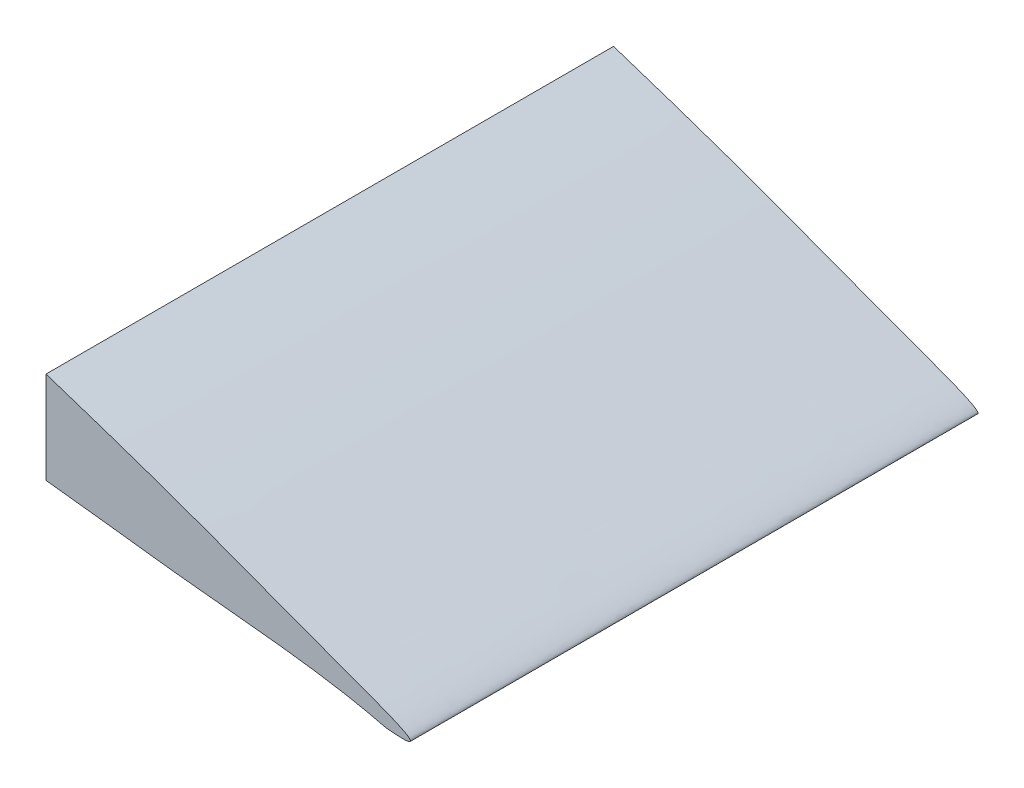
ISO-10303-21;
HEADER;
FILE_DESCRIPTION(('STEP AP214'),'2;1');
FILE_NAME('part.step','',(''),(''),'','','');
FILE_SCHEMA(('AUTOMOTIVE_DESIGN { 1 0 10303 214 1 1 1 1 }'));
ENDSEC;
DATA;
#1=APPLICATION_CONTEXT('core data for automotive mechanical design processes');
#2=APPLICATION_PROTOCOL_DEFINITION('international standard','automotive_design',2000,#1);
#3=PRODUCT_CONTEXT('',#1,'mechanical');
#4=PRODUCT('Part','Part','',(#3));
#5=PRODUCT_RELATED_PRODUCT_CATEGORY('part','',(#4));
#6=PRODUCT_DEFINITION_FORMATION('','',#4);
#7=PRODUCT_DEFINITION_CONTEXT('part definition',#1,'design');
#8=PRODUCT_DEFINITION('design','',#6,#7);
#9=PRODUCT_DEFINITION_SHAPE('','',#8);
#10=(LENGTH_UNIT() NAMED_UNIT(*) SI_UNIT(.MILLI.,.METRE.));
#11=(NAMED_UNIT(*) PLANE_ANGLE_UNIT() SI_UNIT($,.RADIAN.));
#12=(NAMED_UNIT(*) SI_UNIT($,.STERADIAN.) SOLID_ANGLE_UNIT());
#13=UNCERTAINTY_MEASURE_WITH_UNIT(LENGTH_MEASURE(1.E-05),#10,'distance_accuracy_value','');
#14=(GEOMETRIC_REPRESENTATION_CONTEXT(3) GLOBAL_UNCERTAINTY_ASSIGNED_CONTEXT((#13)) GLOBAL_UNIT_ASSIGNED_CONTEXT((#10,
#11,#12)) REPRESENTATION_CONTEXT('',''));
#15=CARTESIAN_POINT('',(0.,0.,0.));
#16=DIRECTION('',(0.,0.,1.));
#17=DIRECTION('',(1.,0.,0.));
#18=AXIS2_PLACEMENT_3D('',#15,#16,#17);
#19=CARTESIAN_POINT('',(0.000560351162113587,0.000130087070423624,50.8));
#20=CARTESIAN_POINT('',(1.23071418869678,-6.92407609127206,50.8));
#21=CARTESIAN_POINT('',(15.3166033306834,-6.18906584099094,50.8));
#22=CARTESIAN_POINT('',(36.4546728163185,-6.09849990105009,50.8));
#23=CARTESIAN_POINT('',(66.5061971849192,-0.586669106973501,50.8));
#24=CARTESIAN_POINT('',(110.497331171581,6.18149522271792,50.8));
#25=CARTESIAN_POINT('',(157.718638091679,9.03065014873911,50.8));
#26=CARTESIAN_POINT('',(205.10142463584,8.83808028186313,50.8));
#27=CARTESIAN_POINT('',(235.858814759408,7.87030619247826,50.8));
#28=CARTESIAN_POINT('',(260.846344817159,5.42741339404395,50.8));
#29=CARTESIAN_POINT('',(276.264022989737,4.51435670375389,50.8));
#30=CARTESIAN_POINT('',(293.989507544058,2.09398731346533,50.8));
#31=CARTESIAN_POINT('',(303.956832564589,1.47095520994628,50.8));
#32=CARTESIAN_POINT('',(309.846313894505,0.000130087070423666,50.8));
#33=B_SPLINE_CURVE_WITH_KNOTS('',3,(#19,#20,#21,#22,#23,#24,#25,#26,#27,#28,#29,#30,#31,#32),
.UNSPECIFIED.,.F.,.F.,(4,1,1,1,1,1,1,1,1,1,1,4),(0.,0.0569078595717698,0.106482711504673,
0.214488052979465,0.341297688349143,0.535095665520157,0.664680853556909,0.794660698192775,
0.828978881532905,0.904725108725214,0.942212919019968,1.),.UNSPECIFIED.);
#34=DIRECTION('',(0.,0.,-1.));
#35=VECTOR('',#34,1.);
#36=SURFACE_OF_LINEAR_EXTRUSION('',#33,#35);
#37=CARTESIAN_POINT('',(279.4,3.9633475918906,50.8));
#38=VERTEX_POINT('',#37);
#39=CARTESIAN_POINT('',(309.846313894505,0.000130087070423864,50.8));
#40=VERTEX_POINT('',#39);
#41=EDGE_CURVE('E64',#38,#40,#33,.T.);
#42=ORIENTED_EDGE('',*,*,#41,.F.);
#43=DIRECTION('',(0.,0.,-1.));
#44=VECTOR('',#43,1.);
#45=CARTESIAN_POINT('',(279.4,3.96334759085364,50.8));
#46=LINE('',#45,#44);
#47=CARTESIAN_POINT('',(279.4,3.9633475918906,0.));
#48=VERTEX_POINT('',#47);
#49=EDGE_CURVE('E75',#38,#48,#46,.T.);
#50=ORIENTED_EDGE('',*,*,#49,.T.);
#51=CARTESIAN_POINT('',(0.000560351162113587,0.000130087070423624,0.));
#52=CARTESIAN_POINT('',(1.23071418869678,-6.92407609127206,0.));
#53=CARTESIAN_POINT('',(15.3166033306834,-6.18906584099094,0.));
#54=CARTESIAN_POINT('',(36.4546728163185,-6.09849990105009,0.));
#55=CARTESIAN_POINT('',(66.5061971849192,-0.586669106973501,0.));
#56=CARTESIAN_POINT('',(110.497331171581,6.18149522271792,0.));
#57=CARTESIAN_POINT('',(157.718638091679,9.03065014873911,0.));
#58=CARTESIAN_POINT('',(205.10142463584,8.83808028186313,0.));
#59=CARTESIAN_POINT('',(235.858814759408,7.87030619247826,0.));
#60=CARTESIAN_POINT('',(260.846344817159,5.42741339404395,0.));
#61=CARTESIAN_POINT('',(276.264022989737,4.51435670375389,0.));
#62=CARTESIAN_POINT('',(293.989507544058,2.09398731346533,0.));
#63=CARTESIAN_POINT('',(303.956832564589,1.47095520994628,0.));
#64=CARTESIAN_POINT('',(309.846313894505,0.000130087070423666,0.));
#65=B_SPLINE_CURVE_WITH_KNOTS('',3,(#51,#52,#53,#54,#55,#56,#57,#58,#59,#60,#61,#62,#63,#64),
.UNSPECIFIED.,.F.,.F.,(4,1,1,1,1,1,1,1,1,1,1,4),(0.,0.0569078595717698,0.106482711504673,
0.214488052979465,0.341297688349143,0.535095665520157,0.664680853556909,0.794660698192775,
0.828978881532905,0.904725108725214,0.942212919019968,1.),.UNSPECIFIED.);
#66=CARTESIAN_POINT('',(309.846313894505,0.000130087070423864,0.));
#67=VERTEX_POINT('',#66);
#68=EDGE_CURVE('E82',#48,#67,#65,.T.);
#69=ORIENTED_EDGE('',*,*,#68,.T.);
#70=DIRECTION('',(0.,0.,-1.));
#71=VECTOR('',#70,1.);
#72=CARTESIAN_POINT('',(309.846313894505,0.000130087070423864,50.8));
#73=LINE('',#72,#71);
#74=EDGE_CURVE('E11',#40,#67,#73,.T.);
#75=ORIENTED_EDGE('',*,*,#74,.F.);
#76=EDGE_LOOP('',(#42,#50,#69,#75));
#77=FACE_BOUND('',#76,.T.);
#78=ADVANCED_FACE('F39',(#77),#36,.F.);
#79=CARTESIAN_POINT('',(309.846313894505,0.000130087070423864,50.8));
#80=CARTESIAN_POINT('',(314.816918223261,-0.51620674157964,50.8));
#81=CARTESIAN_POINT('',(301.273197720551,4.38282813873556,50.8));
#82=CARTESIAN_POINT('',(290.359837670022,8.71099439045776,50.8));
#83=CARTESIAN_POINT('',(256.952064400645,19.5289209482833,50.8));
#84=CARTESIAN_POINT('',(217.961060472083,29.6129748944238,50.8));
#85=CARTESIAN_POINT('',(173.256699242147,40.0411042779434,50.8));
#86=CARTESIAN_POINT('',(131.400792108858,47.8848319151037,50.8));
#87=CARTESIAN_POINT('',(89.5976184754884,49.290763053775,50.8));
#88=CARTESIAN_POINT('',(52.1111282710831,42.0692152748914,50.8));
#89=CARTESIAN_POINT('',(26.2867198183782,29.9751763284633,50.8));
#90=CARTESIAN_POINT('',(8.64909202481883,17.8566051741579,50.8));
#91=CARTESIAN_POINT('',(0.810633126632263,7.35919605469637,50.8));
#92=CARTESIAN_POINT('',(0.000560351162116727,0.000130087070423829,50.8));
#93=B_SPLINE_CURVE_WITH_KNOTS('',3,(#79,#80,#81,#82,#83,#84,#85,#86,#87,#88,#89,#90,#91,#92),
.UNSPECIFIED.,.F.,.F.,(4,1,1,1,1,1,1,1,1,1,1,4),(0.,0.0239417713693992,0.070244030177139,
0.147561721425381,0.308455887006792,0.442387865106874,0.551517565626309,0.687091076796298,
0.811391258419108,0.886311735305172,0.939136382225768,1.),.UNSPECIFIED.);
#94=DIRECTION('',(0.,0.,-1.));
#95=VECTOR('',#94,1.);
#96=SURFACE_OF_LINEAR_EXTRUSION('',#93,#95);
#97=CARTESIAN_POINT('',(309.846313894505,0.000130087070423864,0.));
#98=CARTESIAN_POINT('',(314.816918223261,-0.51620674157964,0.));
#99=CARTESIAN_POINT('',(301.273197720551,4.38282813873556,0.));
#100=CARTESIAN_POINT('',(290.359837670022,8.71099439045776,0.));
#101=CARTESIAN_POINT('',(256.952064400645,19.5289209482833,0.));
#102=CARTESIAN_POINT('',(217.961060472083,29.6129748944238,0.));
#103=CARTESIAN_POINT('',(173.256699242147,40.0411042779434,0.));
#104=CARTESIAN_POINT('',(131.400792108858,47.8848319151037,0.));
#105=CARTESIAN_POINT('',(89.5976184754884,49.290763053775,0.));
#106=CARTESIAN_POINT('',(52.1111282710831,42.0692152748914,0.));
#107=CARTESIAN_POINT('',(26.2867198183782,29.9751763284633,0.));
#108=CARTESIAN_POINT('',(8.64909202481883,17.8566051741579,0.));
#109=CARTESIAN_POINT('',(0.810633126632263,7.35919605469637,0.));
#110=CARTESIAN_POINT('',(0.000560351162116727,0.000130087070423829,0.));
#111=B_SPLINE_CURVE_WITH_KNOTS('',3,(#97,#98,#99,#100,#101,#102,#103,#104,#105,#106,#107,#108,
#109,#110),.UNSPECIFIED.,.F.,.F.,(4,1,1,1,1,1,1,1,1,1,1,4),(0.,0.0239417713693992,
0.070244030177139,0.147561721425381,0.308455887006792,0.442387865106874,0.551517565626309,
0.687091076796298,0.811391258419108,0.886311735305172,0.939136382225768,1.),.UNSPECIFIED.);
#112=CARTESIAN_POINT('',(279.40000000863,12.2074030819404,0.));
#113=VERTEX_POINT('',#112);
#114=EDGE_CURVE('E89',#67,#113,#111,.T.);
#115=ORIENTED_EDGE('',*,*,#114,.T.);
#116=DIRECTION('',(0.,0.,-1.));
#117=VECTOR('',#116,1.);
#118=CARTESIAN_POINT('',(279.4,12.2074030847446,50.8));
#119=LINE('',#118,#117);
#120=CARTESIAN_POINT('',(279.4,12.2074030819404,50.8));
#121=VERTEX_POINT('',#120);
#122=EDGE_CURVE('E55',#113,#121,#119,.F.);
#123=ORIENTED_EDGE('',*,*,#122,.T.);
#124=EDGE_CURVE('E48',#40,#121,#93,.T.);
#125=ORIENTED_EDGE('',*,*,#124,.F.);
#126=ORIENTED_EDGE('',*,*,#74,.T.);
#127=EDGE_LOOP('',(#115,#123,#125,#126));
#128=FACE_BOUND('',#127,.T.);
#129=ADVANCED_FACE('F110',(#128),#96,.F.);
#130=CARTESIAN_POINT('',(153.387816973495,8.33338198857885,50.8));
#131=DIRECTION('',(0.,0.,-1.));
#132=DIRECTION('',(-1.,0.,0.));
#133=AXIS2_PLACEMENT_3D('',#130,#131,#132);
#134=PLANE('',#133);
#135=ORIENTED_EDGE('',*,*,#124,.T.);
#136=DIRECTION('',(0.,1.,0.));
#137=VECTOR('',#136,1.);
#138=CARTESIAN_POINT('',(279.4,-24.2165503945353,50.8));
#139=LINE('',#138,#137);
#140=EDGE_CURVE('E77',#38,#121,#139,.T.);
#141=ORIENTED_EDGE('',*,*,#140,.F.);
#142=ORIENTED_EDGE('',*,*,#41,.T.);
#143=EDGE_LOOP('',(#135,#141,#142));
#144=FACE_BOUND('',#143,.T.);
#145=ADVANCED_FACE('F84',(#144),#134,.F.);
#146=CARTESIAN_POINT('',(153.387816973495,8.33338198857885,0.));
#147=DIRECTION('',(0.,0.,-1.));
#148=DIRECTION('',(-1.,0.,0.));
#149=AXIS2_PLACEMENT_3D('',#146,#147,#148);
#150=PLANE('',#149);
#151=DIRECTION('',(0.,1.,0.));
#152=VECTOR('',#151,1.);
#153=CARTESIAN_POINT('',(279.4,-24.2165503945353,0.));
#154=LINE('',#153,#152);
#155=EDGE_CURVE('E78',#48,#113,#154,.T.);
#156=ORIENTED_EDGE('',*,*,#155,.T.);
#157=ORIENTED_EDGE('',*,*,#114,.F.);
#158=ORIENTED_EDGE('',*,*,#68,.F.);
#159=EDGE_LOOP('',(#156,#157,#158));
#160=FACE_BOUND('',#159,.T.);
#161=ADVANCED_FACE('F114',(#160),#150,.T.);
#162=CARTESIAN_POINT('',(279.4,-24.2165503945353,0.));
#163=DIRECTION('',(1.,0.,0.));
#164=DIRECTION('',(0.,0.,-1.));
#165=AXIS2_PLACEMENT_3D('',#162,#163,#164);
#166=PLANE('',#165);
#167=ORIENTED_EDGE('',*,*,#140,.T.);
#168=ORIENTED_EDGE('',*,*,#122,.F.);
#169=ORIENTED_EDGE('',*,*,#155,.F.);
#170=ORIENTED_EDGE('',*,*,#49,.F.);
#171=EDGE_LOOP('',(#167,#168,#169,#170));
#172=FACE_BOUND('',#171,.T.);
#173=ADVANCED_FACE('F76',(#172),#166,.F.);
#174=CLOSED_SHELL('',(#78,#129,#145,#161,#173));
#175=MANIFOLD_SOLID_BREP('B2',#174);
#176=ADVANCED_BREP_SHAPE_REPRESENTATION('',(#18,#175),#14);
#177=SHAPE_DEFINITION_REPRESENTATION(#9,#176);
ENDSEC;
END-ISO-10303-21;
